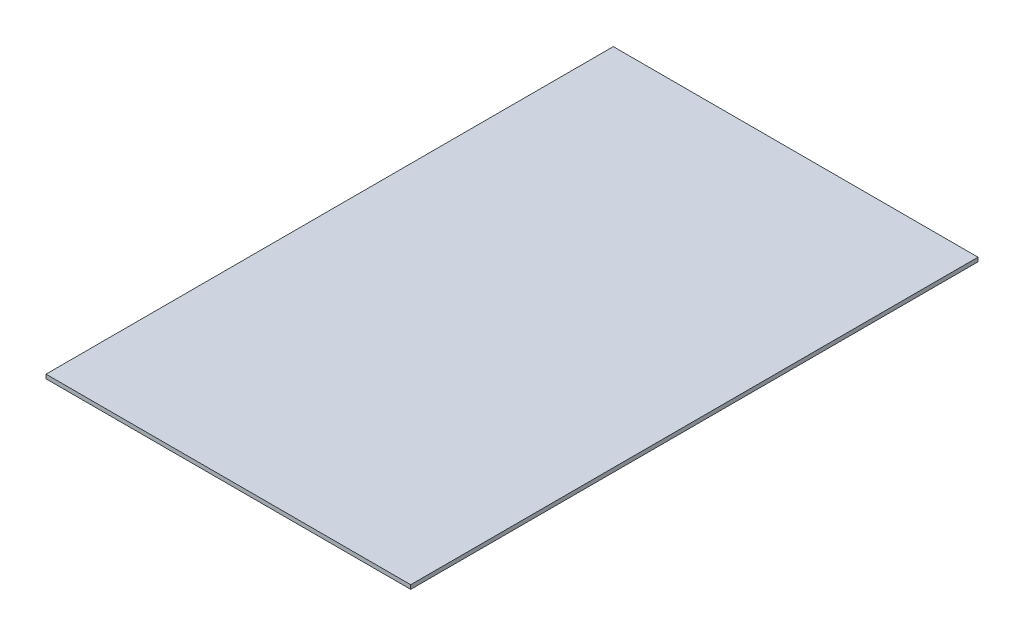
ISO-10303-21;
HEADER;
FILE_DESCRIPTION(('STEP AP214'),'2;1');
FILE_NAME('part.step','',(''),(''),'','','');
FILE_SCHEMA(('AUTOMOTIVE_DESIGN { 1 0 10303 214 1 1 1 1 }'));
ENDSEC;
DATA;
#1=APPLICATION_CONTEXT('core data for automotive mechanical design processes');
#2=APPLICATION_PROTOCOL_DEFINITION('international standard','automotive_design',2000,#1);
#3=PRODUCT_CONTEXT('',#1,'mechanical');
#4=PRODUCT('Part','Part','',(#3));
#5=PRODUCT_RELATED_PRODUCT_CATEGORY('part','',(#4));
#6=PRODUCT_DEFINITION_FORMATION('','',#4);
#7=PRODUCT_DEFINITION_CONTEXT('part definition',#1,'design');
#8=PRODUCT_DEFINITION('design','',#6,#7);
#9=PRODUCT_DEFINITION_SHAPE('','',#8);
#10=(LENGTH_UNIT() NAMED_UNIT(*) SI_UNIT(.MILLI.,.METRE.));
#11=(NAMED_UNIT(*) PLANE_ANGLE_UNIT() SI_UNIT($,.RADIAN.));
#12=(NAMED_UNIT(*) SI_UNIT($,.STERADIAN.) SOLID_ANGLE_UNIT());
#13=UNCERTAINTY_MEASURE_WITH_UNIT(LENGTH_MEASURE(1.E-05),#10,'distance_accuracy_value','');
#14=(GEOMETRIC_REPRESENTATION_CONTEXT(3) GLOBAL_UNCERTAINTY_ASSIGNED_CONTEXT((#13)) GLOBAL_UNIT_ASSIGNED_CONTEXT((#10,
#11,#12)) REPRESENTATION_CONTEXT('',''));
#15=CARTESIAN_POINT('',(0.,0.,0.));
#16=DIRECTION('',(0.,0.,1.));
#17=DIRECTION('',(1.,0.,0.));
#18=AXIS2_PLACEMENT_3D('',#15,#16,#17);
#19=CARTESIAN_POINT('',(0.,2.,280.));
#20=DIRECTION('',(1.,0.,0.));
#21=DIRECTION('',(0.,0.,-1.));
#22=AXIS2_PLACEMENT_3D('',#19,#20,#21);
#23=PLANE('',#22);
#24=DIRECTION('',(0.,0.,1.));
#25=VECTOR('',#24,1.);
#26=CARTESIAN_POINT('',(0.,0.,280.));
#27=LINE('',#26,#25);
#28=CARTESIAN_POINT('',(0.,0.,0.));
#29=VERTEX_POINT('',#28);
#30=CARTESIAN_POINT('',(0.,0.,280.));
#31=VERTEX_POINT('',#30);
#32=EDGE_CURVE('E102',#29,#31,#27,.T.);
#33=ORIENTED_EDGE('',*,*,#32,.T.);
#34=DIRECTION('',(0.,-1.,0.));
#35=VECTOR('',#34,1.);
#36=CARTESIAN_POINT('',(0.,2.,280.));
#37=LINE('',#36,#35);
#38=CARTESIAN_POINT('',(0.,2.,280.));
#39=VERTEX_POINT('',#38);
#40=EDGE_CURVE('E11',#39,#31,#37,.T.);
#41=ORIENTED_EDGE('',*,*,#40,.F.);
#42=DIRECTION('',(0.,0.,1.));
#43=VECTOR('',#42,1.);
#44=CARTESIAN_POINT('',(0.,2.,280.));
#45=LINE('',#44,#43);
#46=CARTESIAN_POINT('',(0.,2.,0.));
#47=VERTEX_POINT('',#46);
#48=EDGE_CURVE('E90',#47,#39,#45,.T.);
#49=ORIENTED_EDGE('',*,*,#48,.F.);
#50=DIRECTION('',(0.,-1.,0.));
#51=VECTOR('',#50,1.);
#52=CARTESIAN_POINT('',(0.,2.,0.));
#53=LINE('',#52,#51);
#54=EDGE_CURVE('E98',#47,#29,#53,.T.);
#55=ORIENTED_EDGE('',*,*,#54,.T.);
#56=EDGE_LOOP('',(#33,#41,#49,#55));
#57=FACE_BOUND('',#56,.T.);
#58=ADVANCED_FACE('F39',(#57),#23,.F.);
#59=CARTESIAN_POINT('',(180.,2.,280.));
#60=DIRECTION('',(0.,0.,-1.));
#61=DIRECTION('',(-1.,0.,0.));
#62=AXIS2_PLACEMENT_3D('',#59,#60,#61);
#63=PLANE('',#62);
#64=DIRECTION('',(1.,0.,0.));
#65=VECTOR('',#64,1.);
#66=CARTESIAN_POINT('',(180.,0.,280.));
#67=LINE('',#66,#65);
#68=CARTESIAN_POINT('',(180.,0.,280.));
#69=VERTEX_POINT('',#68);
#70=EDGE_CURVE('E94',#31,#69,#67,.T.);
#71=ORIENTED_EDGE('',*,*,#70,.T.);
#72=DIRECTION('',(0.,-1.,0.));
#73=VECTOR('',#72,1.);
#74=CARTESIAN_POINT('',(180.,2.,280.));
#75=LINE('',#74,#73);
#76=CARTESIAN_POINT('',(180.,2.,280.));
#77=VERTEX_POINT('',#76);
#78=EDGE_CURVE('E47',#77,#69,#75,.T.);
#79=ORIENTED_EDGE('',*,*,#78,.F.);
#80=DIRECTION('',(1.,0.,0.));
#81=VECTOR('',#80,1.);
#82=CARTESIAN_POINT('',(180.,2.,280.));
#83=LINE('',#82,#81);
#84=EDGE_CURVE('E85',#39,#77,#83,.T.);
#85=ORIENTED_EDGE('',*,*,#84,.F.);
#86=ORIENTED_EDGE('',*,*,#40,.T.);
#87=EDGE_LOOP('',(#71,#79,#85,#86));
#88=FACE_BOUND('',#87,.T.);
#89=ADVANCED_FACE('F93',(#88),#63,.F.);
#90=CARTESIAN_POINT('',(180.,2.,0.));
#91=DIRECTION('',(-1.,0.,0.));
#92=DIRECTION('',(0.,0.,1.));
#93=AXIS2_PLACEMENT_3D('',#90,#91,#92);
#94=PLANE('',#93);
#95=DIRECTION('',(0.,0.,-1.));
#96=VECTOR('',#95,1.);
#97=CARTESIAN_POINT('',(180.,0.,0.));
#98=LINE('',#97,#96);
#99=CARTESIAN_POINT('',(180.,0.,0.));
#100=VERTEX_POINT('',#99);
#101=EDGE_CURVE('E72',#69,#100,#98,.T.);
#102=ORIENTED_EDGE('',*,*,#101,.T.);
#103=DIRECTION('',(0.,-1.,0.));
#104=VECTOR('',#103,1.);
#105=CARTESIAN_POINT('',(180.,2.,0.));
#106=LINE('',#105,#104);
#107=CARTESIAN_POINT('',(180.,2.,0.));
#108=VERTEX_POINT('',#107);
#109=EDGE_CURVE('E95',#108,#100,#106,.T.);
#110=ORIENTED_EDGE('',*,*,#109,.F.);
#111=DIRECTION('',(0.,0.,-1.));
#112=VECTOR('',#111,1.);
#113=CARTESIAN_POINT('',(180.,2.,0.));
#114=LINE('',#113,#112);
#115=EDGE_CURVE('E88',#77,#108,#114,.T.);
#116=ORIENTED_EDGE('',*,*,#115,.F.);
#117=ORIENTED_EDGE('',*,*,#78,.T.);
#118=EDGE_LOOP('',(#102,#110,#116,#117));
#119=FACE_BOUND('',#118,.T.);
#120=ADVANCED_FACE('F96',(#119),#94,.F.);
#121=CARTESIAN_POINT('',(0.,2.,0.));
#122=DIRECTION('',(0.,0.,1.));
#123=DIRECTION('',(1.,0.,0.));
#124=AXIS2_PLACEMENT_3D('',#121,#122,#123);
#125=PLANE('',#124);
#126=DIRECTION('',(-1.,0.,0.));
#127=VECTOR('',#126,1.);
#128=CARTESIAN_POINT('',(0.,0.,0.));
#129=LINE('',#128,#127);
#130=EDGE_CURVE('E78',#100,#29,#129,.T.);
#131=ORIENTED_EDGE('',*,*,#130,.T.);
#132=ORIENTED_EDGE('',*,*,#54,.F.);
#133=DIRECTION('',(-1.,0.,0.));
#134=VECTOR('',#133,1.);
#135=CARTESIAN_POINT('',(0.,2.,0.));
#136=LINE('',#135,#134);
#137=EDGE_CURVE('E55',#108,#47,#136,.T.);
#138=ORIENTED_EDGE('',*,*,#137,.F.);
#139=ORIENTED_EDGE('',*,*,#109,.T.);
#140=EDGE_LOOP('',(#131,#132,#138,#139));
#141=FACE_BOUND('',#140,.T.);
#142=ADVANCED_FACE('F109',(#141),#125,.F.);
#143=CARTESIAN_POINT('',(0.,2.,0.));
#144=DIRECTION('',(0.,-1.,0.));
#145=DIRECTION('',(0.,0.,-1.));
#146=AXIS2_PLACEMENT_3D('',#143,#144,#145);
#147=PLANE('',#146);
#148=ORIENTED_EDGE('',*,*,#48,.T.);
#149=ORIENTED_EDGE('',*,*,#84,.T.);
#150=ORIENTED_EDGE('',*,*,#115,.T.);
#151=ORIENTED_EDGE('',*,*,#137,.T.);
#152=EDGE_LOOP('',(#148,#149,#150,#151));
#153=FACE_BOUND('',#152,.T.);
#154=ADVANCED_FACE('F86',(#153),#147,.F.);
#155=CARTESIAN_POINT('',(0.,0.,0.));
#156=DIRECTION('',(0.,-1.,0.));
#157=DIRECTION('',(0.,0.,-1.));
#158=AXIS2_PLACEMENT_3D('',#155,#156,#157);
#159=PLANE('',#158);
#160=ORIENTED_EDGE('',*,*,#32,.F.);
#161=ORIENTED_EDGE('',*,*,#130,.F.);
#162=ORIENTED_EDGE('',*,*,#101,.F.);
#163=ORIENTED_EDGE('',*,*,#70,.F.);
#164=EDGE_LOOP('',(#160,#161,#162,#163));
#165=FACE_BOUND('',#164,.T.);
#166=ADVANCED_FACE('F112',(#165),#159,.T.);
#167=CLOSED_SHELL('',(#58,#89,#120,#142,#154,#166));
#168=MANIFOLD_SOLID_BREP('B2',#167);
#169=ADVANCED_BREP_SHAPE_REPRESENTATION('',(#18,#168),#14);
#170=SHAPE_DEFINITION_REPRESENTATION(#9,#169);
ENDSEC;
END-ISO-10303-21;
